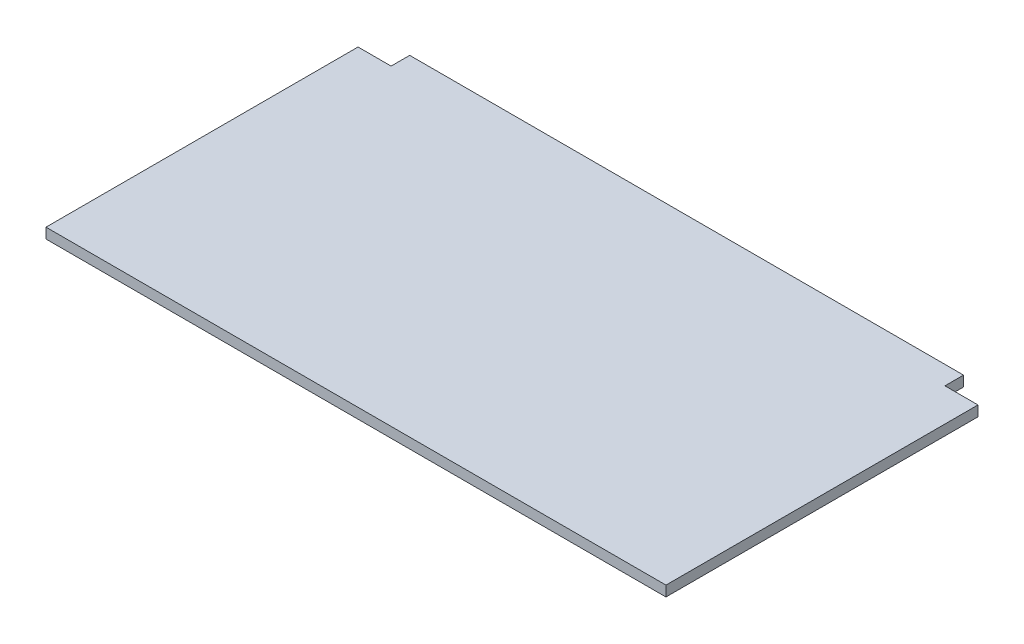
ISO-10303-21;
HEADER;
FILE_DESCRIPTION(('STEP AP214'),'2;1');
FILE_NAME('part.step','',(''),(''),'','','');
FILE_SCHEMA(('AUTOMOTIVE_DESIGN { 1 0 10303 214 1 1 1 1 }'));
ENDSEC;
DATA;
#1=APPLICATION_CONTEXT('core data for automotive mechanical design processes');
#2=APPLICATION_PROTOCOL_DEFINITION('international standard','automotive_design',2000,#1);
#3=PRODUCT_CONTEXT('',#1,'mechanical');
#4=PRODUCT('Part','Part','',(#3));
#5=PRODUCT_RELATED_PRODUCT_CATEGORY('part','',(#4));
#6=PRODUCT_DEFINITION_FORMATION('','',#4);
#7=PRODUCT_DEFINITION_CONTEXT('part definition',#1,'design');
#8=PRODUCT_DEFINITION('design','',#6,#7);
#9=PRODUCT_DEFINITION_SHAPE('','',#8);
#10=(LENGTH_UNIT() NAMED_UNIT(*) SI_UNIT(.MILLI.,.METRE.));
#11=(NAMED_UNIT(*) PLANE_ANGLE_UNIT() SI_UNIT($,.RADIAN.));
#12=(NAMED_UNIT(*) SI_UNIT($,.STERADIAN.) SOLID_ANGLE_UNIT());
#13=UNCERTAINTY_MEASURE_WITH_UNIT(LENGTH_MEASURE(1.E-05),#10,'distance_accuracy_value','');
#14=(GEOMETRIC_REPRESENTATION_CONTEXT(3) GLOBAL_UNCERTAINTY_ASSIGNED_CONTEXT((#13)) GLOBAL_UNIT_ASSIGNED_CONTEXT((#10,
#11,#12)) REPRESENTATION_CONTEXT('',''));
#15=CARTESIAN_POINT('',(0.,0.,0.));
#16=DIRECTION('',(0.,0.,1.));
#17=DIRECTION('',(1.,0.,0.));
#18=AXIS2_PLACEMENT_3D('',#15,#16,#17);
#19=CARTESIAN_POINT('',(750.,25.,400.));
#20=DIRECTION('',(-1.,0.,0.));
#21=DIRECTION('',(0.,0.,1.));
#22=AXIS2_PLACEMENT_3D('',#19,#20,#21);
#23=PLANE('',#22);
#24=DIRECTION('',(0.,1.,0.));
#25=VECTOR('',#24,1.);
#26=CARTESIAN_POINT('',(750.,0.,-355.));
#27=LINE('',#26,#25);
#28=CARTESIAN_POINT('',(750.,0.,-355.));
#29=VERTEX_POINT('',#28);
#30=CARTESIAN_POINT('',(750.,25.,-355.));
#31=VERTEX_POINT('',#30);
#32=EDGE_CURVE('E157',#29,#31,#27,.T.);
#33=ORIENTED_EDGE('',*,*,#32,.T.);
#34=DIRECTION('',(0.,0.,-1.));
#35=VECTOR('',#34,1.);
#36=CARTESIAN_POINT('',(750.,25.,400.));
#37=LINE('',#36,#35);
#38=CARTESIAN_POINT('',(750.,25.,400.));
#39=VERTEX_POINT('',#38);
#40=EDGE_CURVE('E140',#39,#31,#37,.T.);
#41=ORIENTED_EDGE('',*,*,#40,.F.);
#42=DIRECTION('',(0.,-1.,0.));
#43=VECTOR('',#42,1.);
#44=CARTESIAN_POINT('',(750.,25.,400.));
#45=LINE('',#44,#43);
#46=CARTESIAN_POINT('',(750.,0.,400.));
#47=VERTEX_POINT('',#46);
#48=EDGE_CURVE('E44',#39,#47,#45,.T.);
#49=ORIENTED_EDGE('',*,*,#48,.T.);
#50=DIRECTION('',(0.,0.,-1.));
#51=VECTOR('',#50,1.);
#52=CARTESIAN_POINT('',(750.,0.,400.));
#53=LINE('',#52,#51);
#54=EDGE_CURVE('E126',#47,#29,#53,.T.);
#55=ORIENTED_EDGE('',*,*,#54,.T.);
#56=EDGE_LOOP('',(#33,#41,#49,#55));
#57=FACE_BOUND('',#56,.T.);
#58=ADVANCED_FACE('F36',(#57),#23,.F.);
#59=CARTESIAN_POINT('',(750.,25.,-400.));
#60=DIRECTION('',(0.,0.,1.));
#61=DIRECTION('',(1.,0.,0.));
#62=AXIS2_PLACEMENT_3D('',#59,#60,#61);
#63=PLANE('',#62);
#64=DIRECTION('',(0.,1.,0.));
#65=VECTOR('',#64,1.);
#66=CARTESIAN_POINT('',(-670.,0.,-400.));
#67=LINE('',#66,#65);
#68=CARTESIAN_POINT('',(-670.,0.,-400.));
#69=VERTEX_POINT('',#68);
#70=CARTESIAN_POINT('',(-670.,25.,-400.));
#71=VERTEX_POINT('',#70);
#72=EDGE_CURVE('E100',#69,#71,#67,.T.);
#73=ORIENTED_EDGE('',*,*,#72,.T.);
#74=DIRECTION('',(-1.,0.,0.));
#75=VECTOR('',#74,1.);
#76=CARTESIAN_POINT('',(750.,25.,-400.));
#77=LINE('',#76,#75);
#78=CARTESIAN_POINT('',(670.,25.,-400.));
#79=VERTEX_POINT('',#78);
#80=EDGE_CURVE('E135',#79,#71,#77,.T.);
#81=ORIENTED_EDGE('',*,*,#80,.F.);
#82=DIRECTION('',(0.,1.,0.));
#83=VECTOR('',#82,1.);
#84=CARTESIAN_POINT('',(670.,0.,-400.));
#85=LINE('',#84,#83);
#86=CARTESIAN_POINT('',(670.,0.,-400.));
#87=VERTEX_POINT('',#86);
#88=EDGE_CURVE('E124',#87,#79,#85,.T.);
#89=ORIENTED_EDGE('',*,*,#88,.F.);
#90=DIRECTION('',(-1.,0.,0.));
#91=VECTOR('',#90,1.);
#92=CARTESIAN_POINT('',(750.,0.,-400.));
#93=LINE('',#92,#91);
#94=EDGE_CURVE('E118',#87,#69,#93,.T.);
#95=ORIENTED_EDGE('',*,*,#94,.T.);
#96=EDGE_LOOP('',(#73,#81,#89,#95));
#97=FACE_BOUND('',#96,.T.);
#98=ADVANCED_FACE('F123',(#97),#63,.F.);
#99=CARTESIAN_POINT('',(0.,25.,0.));
#100=DIRECTION('',(0.,1.,0.));
#101=DIRECTION('',(0.,0.,1.));
#102=AXIS2_PLACEMENT_3D('',#99,#100,#101);
#103=PLANE('',#102);
#104=ORIENTED_EDGE('',*,*,#80,.T.);
#105=DIRECTION('',(0.,0.,1.));
#106=VECTOR('',#105,1.);
#107=CARTESIAN_POINT('',(-670.,25.,0.));
#108=LINE('',#107,#106);
#109=CARTESIAN_POINT('',(-670.,25.,-355.));
#110=VERTEX_POINT('',#109);
#111=EDGE_CURVE('E106',#71,#110,#108,.T.);
#112=ORIENTED_EDGE('',*,*,#111,.T.);
#113=DIRECTION('',(1.,0.,0.));
#114=VECTOR('',#113,1.);
#115=CARTESIAN_POINT('',(0.,25.,-355.));
#116=LINE('',#115,#114);
#117=CARTESIAN_POINT('',(-750.,25.,-355.));
#118=VERTEX_POINT('',#117);
#119=EDGE_CURVE('E120',#118,#110,#116,.T.);
#120=ORIENTED_EDGE('',*,*,#119,.F.);
#121=DIRECTION('',(0.,0.,1.));
#122=VECTOR('',#121,1.);
#123=CARTESIAN_POINT('',(-750.,25.,400.));
#124=LINE('',#123,#122);
#125=CARTESIAN_POINT('',(-750.,25.,400.));
#126=VERTEX_POINT('',#125);
#127=EDGE_CURVE('E125',#118,#126,#124,.T.);
#128=ORIENTED_EDGE('',*,*,#127,.T.);
#129=DIRECTION('',(1.,0.,0.));
#130=VECTOR('',#129,1.);
#131=CARTESIAN_POINT('',(750.,25.,400.));
#132=LINE('',#131,#130);
#133=EDGE_CURVE('E128',#126,#39,#132,.T.);
#134=ORIENTED_EDGE('',*,*,#133,.T.);
#135=ORIENTED_EDGE('',*,*,#40,.T.);
#136=DIRECTION('',(-1.,0.,0.));
#137=VECTOR('',#136,1.);
#138=CARTESIAN_POINT('',(0.,25.,-355.));
#139=LINE('',#138,#137);
#140=CARTESIAN_POINT('',(670.,25.,-355.));
#141=VERTEX_POINT('',#140);
#142=EDGE_CURVE('E162',#31,#141,#139,.T.);
#143=ORIENTED_EDGE('',*,*,#142,.T.);
#144=DIRECTION('',(0.,0.,1.));
#145=VECTOR('',#144,1.);
#146=CARTESIAN_POINT('',(670.,25.,0.));
#147=LINE('',#146,#145);
#148=EDGE_CURVE('E170',#79,#141,#147,.T.);
#149=ORIENTED_EDGE('',*,*,#148,.F.);
#150=EDGE_LOOP('',(#104,#112,#120,#128,#134,#135,#143,#149));
#151=FACE_BOUND('',#150,.T.);
#152=ADVANCED_FACE('F161',(#151),#103,.T.);
#153=CARTESIAN_POINT('',(0.,0.,0.));
#154=DIRECTION('',(0.,1.,0.));
#155=DIRECTION('',(0.,0.,1.));
#156=AXIS2_PLACEMENT_3D('',#153,#154,#155);
#157=PLANE('',#156);
#158=DIRECTION('',(0.,0.,1.));
#159=VECTOR('',#158,1.);
#160=CARTESIAN_POINT('',(-670.,0.,0.));
#161=LINE('',#160,#159);
#162=CARTESIAN_POINT('',(-670.,0.,-355.));
#163=VERTEX_POINT('',#162);
#164=EDGE_CURVE('E103',#69,#163,#161,.T.);
#165=ORIENTED_EDGE('',*,*,#164,.F.);
#166=ORIENTED_EDGE('',*,*,#94,.F.);
#167=DIRECTION('',(0.,0.,1.));
#168=VECTOR('',#167,1.);
#169=CARTESIAN_POINT('',(670.,0.,0.));
#170=LINE('',#169,#168);
#171=CARTESIAN_POINT('',(670.,0.,-355.));
#172=VERTEX_POINT('',#171);
#173=EDGE_CURVE('E169',#87,#172,#170,.T.);
#174=ORIENTED_EDGE('',*,*,#173,.T.);
#175=DIRECTION('',(-1.,0.,0.));
#176=VECTOR('',#175,1.);
#177=CARTESIAN_POINT('',(0.,0.,-355.));
#178=LINE('',#177,#176);
#179=EDGE_CURVE('E155',#29,#172,#178,.T.);
#180=ORIENTED_EDGE('',*,*,#179,.F.);
#181=ORIENTED_EDGE('',*,*,#54,.F.);
#182=DIRECTION('',(1.,0.,0.));
#183=VECTOR('',#182,1.);
#184=CARTESIAN_POINT('',(750.,0.,400.));
#185=LINE('',#184,#183);
#186=CARTESIAN_POINT('',(-750.,0.,400.));
#187=VERTEX_POINT('',#186);
#188=EDGE_CURVE('E131',#187,#47,#185,.T.);
#189=ORIENTED_EDGE('',*,*,#188,.F.);
#190=DIRECTION('',(0.,0.,1.));
#191=VECTOR('',#190,1.);
#192=CARTESIAN_POINT('',(-750.,0.,400.));
#193=LINE('',#192,#191);
#194=CARTESIAN_POINT('',(-750.,0.,-355.));
#195=VERTEX_POINT('',#194);
#196=EDGE_CURVE('E148',#195,#187,#193,.T.);
#197=ORIENTED_EDGE('',*,*,#196,.F.);
#198=DIRECTION('',(1.,0.,0.));
#199=VECTOR('',#198,1.);
#200=CARTESIAN_POINT('',(0.,0.,-355.));
#201=LINE('',#200,#199);
#202=EDGE_CURVE('E112',#195,#163,#201,.T.);
#203=ORIENTED_EDGE('',*,*,#202,.T.);
#204=EDGE_LOOP('',(#165,#166,#174,#180,#181,#189,#197,#203));
#205=FACE_BOUND('',#204,.T.);
#206=ADVANCED_FACE('F116',(#205),#157,.F.);
#207=CARTESIAN_POINT('',(-750.,25.,400.));
#208=DIRECTION('',(1.,0.,0.));
#209=DIRECTION('',(0.,0.,-1.));
#210=AXIS2_PLACEMENT_3D('',#207,#208,#209);
#211=PLANE('',#210);
#212=ORIENTED_EDGE('',*,*,#127,.F.);
#213=DIRECTION('',(0.,1.,0.));
#214=VECTOR('',#213,1.);
#215=CARTESIAN_POINT('',(-750.,0.,-355.));
#216=LINE('',#215,#214);
#217=EDGE_CURVE('E111',#195,#118,#216,.T.);
#218=ORIENTED_EDGE('',*,*,#217,.F.);
#219=ORIENTED_EDGE('',*,*,#196,.T.);
#220=DIRECTION('',(0.,-1.,0.));
#221=VECTOR('',#220,1.);
#222=CARTESIAN_POINT('',(-750.,25.,400.));
#223=LINE('',#222,#221);
#224=EDGE_CURVE('E11',#126,#187,#223,.T.);
#225=ORIENTED_EDGE('',*,*,#224,.F.);
#226=EDGE_LOOP('',(#212,#218,#219,#225));
#227=FACE_BOUND('',#226,.T.);
#228=ADVANCED_FACE('F38',(#227),#211,.F.);
#229=CARTESIAN_POINT('',(750.,25.,400.));
#230=DIRECTION('',(0.,0.,-1.));
#231=DIRECTION('',(-1.,0.,0.));
#232=AXIS2_PLACEMENT_3D('',#229,#230,#231);
#233=PLANE('',#232);
#234=ORIENTED_EDGE('',*,*,#188,.T.);
#235=ORIENTED_EDGE('',*,*,#48,.F.);
#236=ORIENTED_EDGE('',*,*,#133,.F.);
#237=ORIENTED_EDGE('',*,*,#224,.T.);
#238=EDGE_LOOP('',(#234,#235,#236,#237));
#239=FACE_BOUND('',#238,.T.);
#240=ADVANCED_FACE('F151',(#239),#233,.F.);
#241=CARTESIAN_POINT('',(0.,0.,-355.));
#242=DIRECTION('',(0.,0.,-1.));
#243=DIRECTION('',(-1.,0.,0.));
#244=AXIS2_PLACEMENT_3D('',#241,#242,#243);
#245=PLANE('',#244);
#246=ORIENTED_EDGE('',*,*,#142,.F.);
#247=ORIENTED_EDGE('',*,*,#32,.F.);
#248=ORIENTED_EDGE('',*,*,#179,.T.);
#249=DIRECTION('',(0.,1.,0.));
#250=VECTOR('',#249,1.);
#251=CARTESIAN_POINT('',(670.,0.,-355.));
#252=LINE('',#251,#250);
#253=EDGE_CURVE('E59',#172,#141,#252,.T.);
#254=ORIENTED_EDGE('',*,*,#253,.T.);
#255=EDGE_LOOP('',(#246,#247,#248,#254));
#256=FACE_BOUND('',#255,.T.);
#257=ADVANCED_FACE('F196',(#256),#245,.T.);
#258=CARTESIAN_POINT('',(670.,0.,0.));
#259=DIRECTION('',(-1.,0.,0.));
#260=DIRECTION('',(0.,0.,1.));
#261=AXIS2_PLACEMENT_3D('',#258,#259,#260);
#262=PLANE('',#261);
#263=ORIENTED_EDGE('',*,*,#148,.T.);
#264=ORIENTED_EDGE('',*,*,#253,.F.);
#265=ORIENTED_EDGE('',*,*,#173,.F.);
#266=ORIENTED_EDGE('',*,*,#88,.T.);
#267=EDGE_LOOP('',(#263,#264,#265,#266));
#268=FACE_BOUND('',#267,.T.);
#269=ADVANCED_FACE('F186',(#268),#262,.F.);
#270=CARTESIAN_POINT('',(-670.,0.,0.));
#271=DIRECTION('',(-1.,0.,0.));
#272=DIRECTION('',(0.,0.,1.));
#273=AXIS2_PLACEMENT_3D('',#270,#271,#272);
#274=PLANE('',#273);
#275=ORIENTED_EDGE('',*,*,#111,.F.);
#276=ORIENTED_EDGE('',*,*,#72,.F.);
#277=ORIENTED_EDGE('',*,*,#164,.T.);
#278=DIRECTION('',(0.,1.,0.));
#279=VECTOR('',#278,1.);
#280=CARTESIAN_POINT('',(-670.,0.,-355.));
#281=LINE('',#280,#279);
#282=EDGE_CURVE('E51',#163,#110,#281,.T.);
#283=ORIENTED_EDGE('',*,*,#282,.T.);
#284=EDGE_LOOP('',(#275,#276,#277,#283));
#285=FACE_BOUND('',#284,.T.);
#286=ADVANCED_FACE('F102',(#285),#274,.T.);
#287=CARTESIAN_POINT('',(0.,0.,-355.));
#288=DIRECTION('',(0.,0.,1.));
#289=DIRECTION('',(1.,0.,0.));
#290=AXIS2_PLACEMENT_3D('',#287,#288,#289);
#291=PLANE('',#290);
#292=ORIENTED_EDGE('',*,*,#119,.T.);
#293=ORIENTED_EDGE('',*,*,#282,.F.);
#294=ORIENTED_EDGE('',*,*,#202,.F.);
#295=ORIENTED_EDGE('',*,*,#217,.T.);
#296=EDGE_LOOP('',(#292,#293,#294,#295));
#297=FACE_BOUND('',#296,.T.);
#298=ADVANCED_FACE('F180',(#297),#291,.F.);
#299=CLOSED_SHELL('',(#58,#98,#152,#206,#228,#240,#257,#269,#286,#298));
#300=MANIFOLD_SOLID_BREP('B2',#299);
#301=ADVANCED_BREP_SHAPE_REPRESENTATION('',(#18,#300),#14);
#302=SHAPE_DEFINITION_REPRESENTATION(#9,#301);
ENDSEC;
END-ISO-10303-21;
